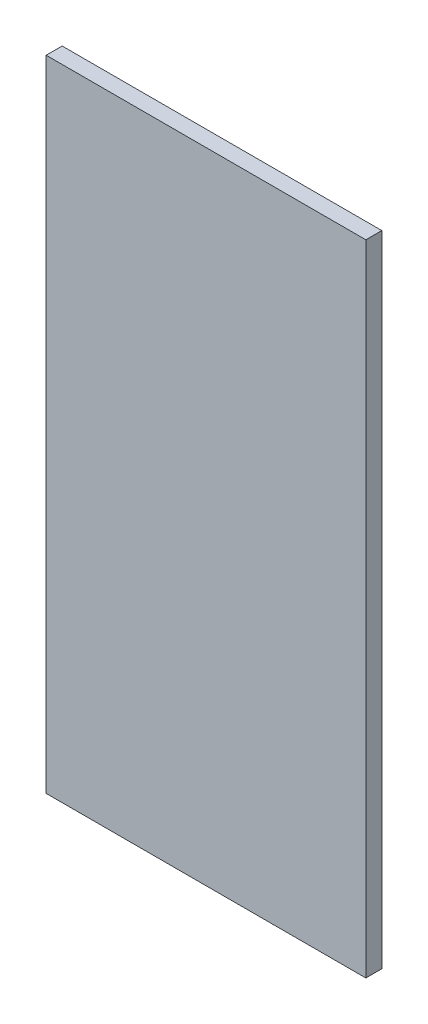
ISO-10303-21;
HEADER;
FILE_DESCRIPTION(('STEP AP214'),'2;1');
FILE_NAME('part.step','',(''),(''),'','','');
FILE_SCHEMA(('AUTOMOTIVE_DESIGN { 1 0 10303 214 1 1 1 1 }'));
ENDSEC;
DATA;
#1=APPLICATION_CONTEXT('core data for automotive mechanical design processes');
#2=APPLICATION_PROTOCOL_DEFINITION('international standard','automotive_design',2000,#1);
#3=PRODUCT_CONTEXT('',#1,'mechanical');
#4=PRODUCT('Part','Part','',(#3));
#5=PRODUCT_RELATED_PRODUCT_CATEGORY('part','',(#4));
#6=PRODUCT_DEFINITION_FORMATION('','',#4);
#7=PRODUCT_DEFINITION_CONTEXT('part definition',#1,'design');
#8=PRODUCT_DEFINITION('design','',#6,#7);
#9=PRODUCT_DEFINITION_SHAPE('','',#8);
#10=(LENGTH_UNIT() NAMED_UNIT(*) SI_UNIT(.MILLI.,.METRE.));
#11=(NAMED_UNIT(*) PLANE_ANGLE_UNIT() SI_UNIT($,.RADIAN.));
#12=(NAMED_UNIT(*) SI_UNIT($,.STERADIAN.) SOLID_ANGLE_UNIT());
#13=UNCERTAINTY_MEASURE_WITH_UNIT(LENGTH_MEASURE(1.E-05),#10,'distance_accuracy_value','');
#14=(GEOMETRIC_REPRESENTATION_CONTEXT(3) GLOBAL_UNCERTAINTY_ASSIGNED_CONTEXT((#13)) GLOBAL_UNIT_ASSIGNED_CONTEXT((#10,
#11,#12)) REPRESENTATION_CONTEXT('',''));
#15=CARTESIAN_POINT('',(0.,0.,0.));
#16=DIRECTION('',(0.,0.,1.));
#17=DIRECTION('',(1.,0.,0.));
#18=AXIS2_PLACEMENT_3D('',#15,#16,#17);
#19=CARTESIAN_POINT('',(0.,0.,30.));
#20=DIRECTION('',(1.,0.,0.));
#21=DIRECTION('',(0.,0.,-1.));
#22=AXIS2_PLACEMENT_3D('',#19,#20,#21);
#23=PLANE('',#22);
#24=DIRECTION('',(0.,-1.,0.));
#25=VECTOR('',#24,1.);
#26=CARTESIAN_POINT('',(0.,0.,0.));
#27=LINE('',#26,#25);
#28=CARTESIAN_POINT('',(0.,1200.,0.));
#29=VERTEX_POINT('',#28);
#30=CARTESIAN_POINT('',(0.,0.,0.));
#31=VERTEX_POINT('',#30);
#32=EDGE_CURVE('E96',#29,#31,#27,.T.);
#33=ORIENTED_EDGE('',*,*,#32,.T.);
#34=DIRECTION('',(0.,0.,-1.));
#35=VECTOR('',#34,1.);
#36=CARTESIAN_POINT('',(0.,0.,30.));
#37=LINE('',#36,#35);
#38=CARTESIAN_POINT('',(0.,0.,30.));
#39=VERTEX_POINT('',#38);
#40=EDGE_CURVE('E11',#39,#31,#37,.T.);
#41=ORIENTED_EDGE('',*,*,#40,.F.);
#42=DIRECTION('',(0.,-1.,0.));
#43=VECTOR('',#42,1.);
#44=CARTESIAN_POINT('',(0.,0.,30.));
#45=LINE('',#44,#43);
#46=CARTESIAN_POINT('',(0.,1200.,30.));
#47=VERTEX_POINT('',#46);
#48=EDGE_CURVE('E84',#47,#39,#45,.T.);
#49=ORIENTED_EDGE('',*,*,#48,.F.);
#50=DIRECTION('',(0.,0.,-1.));
#51=VECTOR('',#50,1.);
#52=CARTESIAN_POINT('',(0.,1200.,30.));
#53=LINE('',#52,#51);
#54=EDGE_CURVE('E92',#47,#29,#53,.T.);
#55=ORIENTED_EDGE('',*,*,#54,.T.);
#56=EDGE_LOOP('',(#33,#41,#49,#55));
#57=FACE_BOUND('',#56,.T.);
#58=ADVANCED_FACE('F33',(#57),#23,.F.);
#59=CARTESIAN_POINT('',(0.,0.,30.));
#60=DIRECTION('',(0.,1.,0.));
#61=DIRECTION('',(0.,0.,1.));
#62=AXIS2_PLACEMENT_3D('',#59,#60,#61);
#63=PLANE('',#62);
#64=DIRECTION('',(1.,0.,0.));
#65=VECTOR('',#64,1.);
#66=CARTESIAN_POINT('',(0.,0.,0.));
#67=LINE('',#66,#65);
#68=CARTESIAN_POINT('',(600.,0.,0.));
#69=VERTEX_POINT('',#68);
#70=EDGE_CURVE('E88',#31,#69,#67,.T.);
#71=ORIENTED_EDGE('',*,*,#70,.T.);
#72=DIRECTION('',(0.,0.,-1.));
#73=VECTOR('',#72,1.);
#74=CARTESIAN_POINT('',(600.,0.,30.));
#75=LINE('',#74,#73);
#76=CARTESIAN_POINT('',(600.,0.,30.));
#77=VERTEX_POINT('',#76);
#78=EDGE_CURVE('E41',#77,#69,#75,.T.);
#79=ORIENTED_EDGE('',*,*,#78,.F.);
#80=DIRECTION('',(1.,0.,0.));
#81=VECTOR('',#80,1.);
#82=CARTESIAN_POINT('',(0.,0.,30.));
#83=LINE('',#82,#81);
#84=EDGE_CURVE('E79',#39,#77,#83,.T.);
#85=ORIENTED_EDGE('',*,*,#84,.F.);
#86=ORIENTED_EDGE('',*,*,#40,.T.);
#87=EDGE_LOOP('',(#71,#79,#85,#86));
#88=FACE_BOUND('',#87,.T.);
#89=ADVANCED_FACE('F87',(#88),#63,.F.);
#90=CARTESIAN_POINT('',(600.,0.,30.));
#91=DIRECTION('',(-1.,0.,0.));
#92=DIRECTION('',(0.,0.,1.));
#93=AXIS2_PLACEMENT_3D('',#90,#91,#92);
#94=PLANE('',#93);
#95=DIRECTION('',(0.,1.,0.));
#96=VECTOR('',#95,1.);
#97=CARTESIAN_POINT('',(600.,0.,0.));
#98=LINE('',#97,#96);
#99=CARTESIAN_POINT('',(600.,1200.,0.));
#100=VERTEX_POINT('',#99);
#101=EDGE_CURVE('E66',#69,#100,#98,.T.);
#102=ORIENTED_EDGE('',*,*,#101,.T.);
#103=DIRECTION('',(0.,0.,-1.));
#104=VECTOR('',#103,1.);
#105=CARTESIAN_POINT('',(600.,1200.,30.));
#106=LINE('',#105,#104);
#107=CARTESIAN_POINT('',(600.,1200.,30.));
#108=VERTEX_POINT('',#107);
#109=EDGE_CURVE('E89',#108,#100,#106,.T.);
#110=ORIENTED_EDGE('',*,*,#109,.F.);
#111=DIRECTION('',(0.,1.,0.));
#112=VECTOR('',#111,1.);
#113=CARTESIAN_POINT('',(600.,0.,30.));
#114=LINE('',#113,#112);
#115=EDGE_CURVE('E82',#77,#108,#114,.T.);
#116=ORIENTED_EDGE('',*,*,#115,.F.);
#117=ORIENTED_EDGE('',*,*,#78,.T.);
#118=EDGE_LOOP('',(#102,#110,#116,#117));
#119=FACE_BOUND('',#118,.T.);
#120=ADVANCED_FACE('F90',(#119),#94,.F.);
#121=CARTESIAN_POINT('',(0.,1200.,30.));
#122=DIRECTION('',(0.,-1.,0.));
#123=DIRECTION('',(0.,0.,-1.));
#124=AXIS2_PLACEMENT_3D('',#121,#122,#123);
#125=PLANE('',#124);
#126=DIRECTION('',(-1.,0.,0.));
#127=VECTOR('',#126,1.);
#128=CARTESIAN_POINT('',(0.,1200.,0.));
#129=LINE('',#128,#127);
#130=EDGE_CURVE('E72',#100,#29,#129,.T.);
#131=ORIENTED_EDGE('',*,*,#130,.T.);
#132=ORIENTED_EDGE('',*,*,#54,.F.);
#133=DIRECTION('',(-1.,0.,0.));
#134=VECTOR('',#133,1.);
#135=CARTESIAN_POINT('',(0.,1200.,30.));
#136=LINE('',#135,#134);
#137=EDGE_CURVE('E49',#108,#47,#136,.T.);
#138=ORIENTED_EDGE('',*,*,#137,.F.);
#139=ORIENTED_EDGE('',*,*,#109,.T.);
#140=EDGE_LOOP('',(#131,#132,#138,#139));
#141=FACE_BOUND('',#140,.T.);
#142=ADVANCED_FACE('F103',(#141),#125,.F.);
#143=CARTESIAN_POINT('',(0.,0.,30.));
#144=DIRECTION('',(0.,0.,-1.));
#145=DIRECTION('',(-1.,0.,0.));
#146=AXIS2_PLACEMENT_3D('',#143,#144,#145);
#147=PLANE('',#146);
#148=ORIENTED_EDGE('',*,*,#48,.T.);
#149=ORIENTED_EDGE('',*,*,#84,.T.);
#150=ORIENTED_EDGE('',*,*,#115,.T.);
#151=ORIENTED_EDGE('',*,*,#137,.T.);
#152=EDGE_LOOP('',(#148,#149,#150,#151));
#153=FACE_BOUND('',#152,.T.);
#154=ADVANCED_FACE('F80',(#153),#147,.F.);
#155=CARTESIAN_POINT('',(0.,0.,0.));
#156=DIRECTION('',(0.,0.,-1.));
#157=DIRECTION('',(-1.,0.,0.));
#158=AXIS2_PLACEMENT_3D('',#155,#156,#157);
#159=PLANE('',#158);
#160=ORIENTED_EDGE('',*,*,#32,.F.);
#161=ORIENTED_EDGE('',*,*,#130,.F.);
#162=ORIENTED_EDGE('',*,*,#101,.F.);
#163=ORIENTED_EDGE('',*,*,#70,.F.);
#164=EDGE_LOOP('',(#160,#161,#162,#163));
#165=FACE_BOUND('',#164,.T.);
#166=ADVANCED_FACE('F106',(#165),#159,.T.);
#167=CLOSED_SHELL('',(#58,#89,#120,#142,#154,#166));
#168=MANIFOLD_SOLID_BREP('B2',#167);
#169=ADVANCED_BREP_SHAPE_REPRESENTATION('',(#18,#168),#14);
#170=SHAPE_DEFINITION_REPRESENTATION(#9,#169);
ENDSEC;
END-ISO-10303-21;
